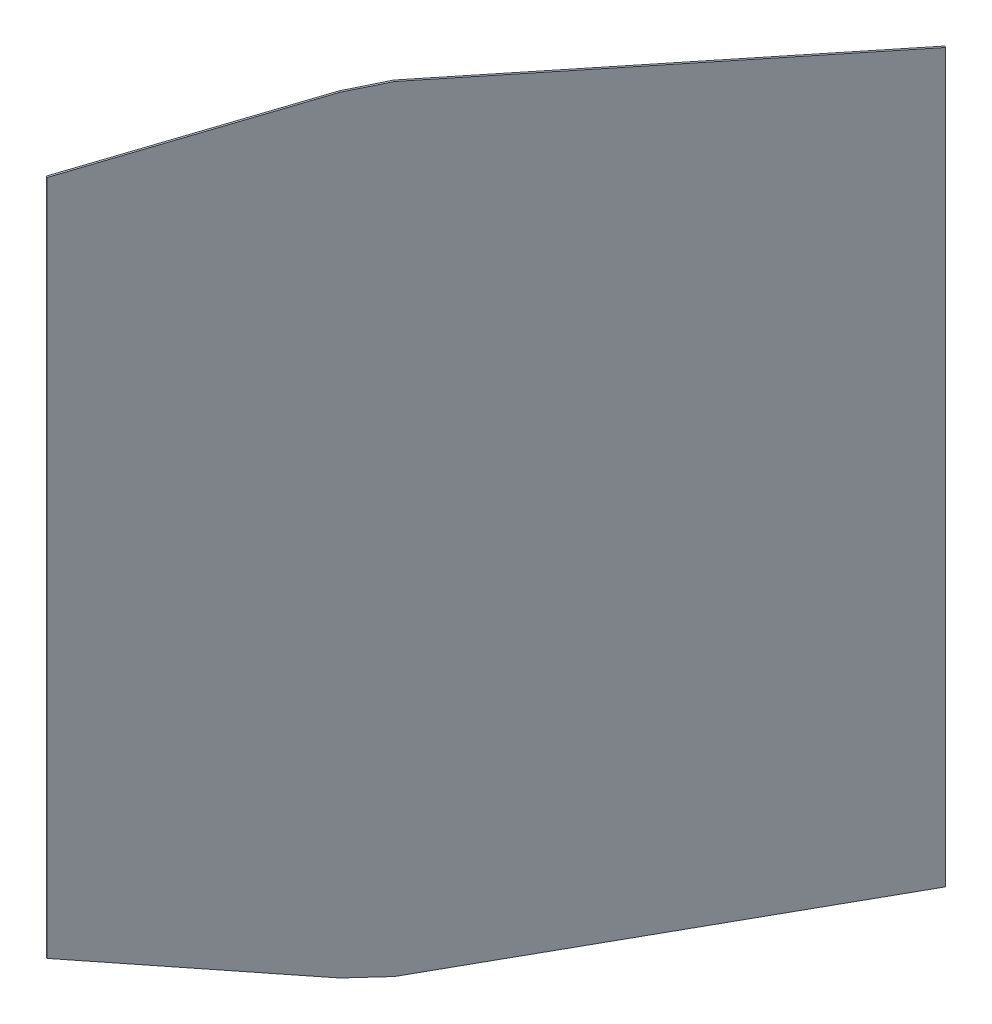
ISO-10303-21;
HEADER;
FILE_DESCRIPTION(('STEP AP214'),'2;1');
FILE_NAME('part.step','',(''),(''),'','','');
FILE_SCHEMA(('AUTOMOTIVE_DESIGN { 1 0 10303 214 1 1 1 1 }'));
ENDSEC;
DATA;
#1=APPLICATION_CONTEXT('core data for automotive mechanical design processes');
#2=APPLICATION_PROTOCOL_DEFINITION('international standard','automotive_design',2000,#1);
#3=PRODUCT_CONTEXT('',#1,'mechanical');
#4=PRODUCT('Part','Part','',(#3));
#5=PRODUCT_RELATED_PRODUCT_CATEGORY('part','',(#4));
#6=PRODUCT_DEFINITION_FORMATION('','',#4);
#7=PRODUCT_DEFINITION_CONTEXT('part definition',#1,'design');
#8=PRODUCT_DEFINITION('design','',#6,#7);
#9=PRODUCT_DEFINITION_SHAPE('','',#8);
#10=(LENGTH_UNIT() NAMED_UNIT(*) SI_UNIT(.MILLI.,.METRE.));
#11=(NAMED_UNIT(*) PLANE_ANGLE_UNIT() SI_UNIT($,.RADIAN.));
#12=(NAMED_UNIT(*) SI_UNIT($,.STERADIAN.) SOLID_ANGLE_UNIT());
#13=UNCERTAINTY_MEASURE_WITH_UNIT(LENGTH_MEASURE(1.E-05),#10,'distance_accuracy_value','');
#14=(GEOMETRIC_REPRESENTATION_CONTEXT(3) GLOBAL_UNCERTAINTY_ASSIGNED_CONTEXT((#13)) GLOBAL_UNIT_ASSIGNED_CONTEXT((#10,
#11,#12)) REPRESENTATION_CONTEXT('',''));
#15=CARTESIAN_POINT('',(0.,0.,0.));
#16=DIRECTION('',(0.,0.,1.));
#17=DIRECTION('',(1.,0.,0.));
#18=AXIS2_PLACEMENT_3D('',#15,#16,#17);
#19=CARTESIAN_POINT('',(339.81309129018,-327.069971053229,-23.014472629478));
#20=DIRECTION('',(-0.559192903470745,0.,0.829037572555043));
#21=DIRECTION('',(0.829037572555043,0.,0.559192903470745));
#22=AXIS2_PLACEMENT_3D('',#19,#20,#21);
#23=PLANE('',#22);
#24=DIRECTION('',(0.,1.,0.));
#25=VECTOR('',#24,1.);
#26=CARTESIAN_POINT('',(338.444350257892,-327.069971053229,-23.9377001131082));
#27=LINE('',#26,#25);
#28=CARTESIAN_POINT('',(338.444350257892,-327.069971053229,-23.9377001131082));
#29=VERTEX_POINT('',#28);
#30=CARTESIAN_POINT('',(338.444350257892,327.069971053229,-23.9377001131082));
#31=VERTEX_POINT('',#30);
#32=EDGE_CURVE('E132',#29,#31,#27,.T.);
#33=ORIENTED_EDGE('',*,*,#32,.T.);
#34=DIRECTION('',(-0.829037572555043,0.,-0.559192903470745));
#35=VECTOR('',#34,1.);
#36=CARTESIAN_POINT('',(339.81309129018,327.069971053229,-23.014472629478));
#37=LINE('',#36,#35);
#38=CARTESIAN_POINT('',(339.81309129018,327.069971053229,-23.014472629478));
#39=VERTEX_POINT('',#38);
#40=EDGE_CURVE('E11',#39,#31,#37,.T.);
#41=ORIENTED_EDGE('',*,*,#40,.F.);
#42=DIRECTION('',(0.,1.,0.));
#43=VECTOR('',#42,1.);
#44=CARTESIAN_POINT('',(339.81309129018,-327.069971053229,-23.014472629478));
#45=LINE('',#44,#43);
#46=CARTESIAN_POINT('',(339.81309129018,-327.069971053229,-23.014472629478));
#47=VERTEX_POINT('',#46);
#48=EDGE_CURVE('E146',#47,#39,#45,.T.);
#49=ORIENTED_EDGE('',*,*,#48,.F.);
#50=DIRECTION('',(-0.829037572555043,0.,-0.559192903470745));
#51=VECTOR('',#50,1.);
#52=CARTESIAN_POINT('',(339.81309129018,-327.069971053229,-23.014472629478));
#53=LINE('',#52,#51);
#54=EDGE_CURVE('E128',#47,#29,#53,.T.);
#55=ORIENTED_EDGE('',*,*,#54,.T.);
#56=EDGE_LOOP('',(#33,#41,#49,#55));
#57=FACE_BOUND('',#56,.T.);
#58=ADVANCED_FACE('F36',(#57),#23,.F.);
#59=CARTESIAN_POINT('',(339.81309129018,327.069971053229,-23.014472629478));
#60=DIRECTION('',(-0.033887074630931,-0.998162132782215,0.0502396541848968));
#61=DIRECTION('',(0.,-0.050268524999457,-0.998735738518643));
#62=AXIS2_PLACEMENT_3D('',#59,#60,#61);
#63=PLANE('',#62);
#64=DIRECTION('',(-0.558165181165038,0.0605999726044517,0.827513911578132));
#65=VECTOR('',#64,1.);
#66=CARTESIAN_POINT('',(338.444350257892,327.069971053229,-23.9377001131082));
#67=LINE('',#66,#65);
#68=CARTESIAN_POINT('',(138.662209663485,348.760310500075,272.251503738087));
#69=VERTEX_POINT('',#68);
#70=EDGE_CURVE('E135',#31,#69,#67,.T.);
#71=ORIENTED_EDGE('',*,*,#70,.T.);
#72=DIRECTION('',(-0.829037572555043,0.,-0.559192903470745));
#73=VECTOR('',#72,1.);
#74=CARTESIAN_POINT('',(140.030950695773,348.760310500075,273.174731221717));
#75=LINE('',#74,#73);
#76=CARTESIAN_POINT('',(140.030950695773,348.760310500075,273.174731221717));
#77=VERTEX_POINT('',#76);
#78=EDGE_CURVE('E44',#77,#69,#75,.T.);
#79=ORIENTED_EDGE('',*,*,#78,.F.);
#80=DIRECTION('',(-0.558165181165038,0.0605999726044517,0.827513911578132));
#81=VECTOR('',#80,1.);
#82=CARTESIAN_POINT('',(339.81309129018,327.069971053229,-23.014472629478));
#83=LINE('',#82,#81);
#84=EDGE_CURVE('E95',#39,#77,#83,.T.);
#85=ORIENTED_EDGE('',*,*,#84,.F.);
#86=ORIENTED_EDGE('',*,*,#40,.T.);
#87=EDGE_LOOP('',(#71,#79,#85,#86));
#88=FACE_BOUND('',#87,.T.);
#89=ADVANCED_FACE('F181',(#88),#63,.F.);
#90=CARTESIAN_POINT('',(140.030950695773,348.760310500075,273.174731221717));
#91=DIRECTION('',(0.0572926382122758,-0.994737542783383,-0.0849398291966421));
#92=DIRECTION('',(0.,0.08507957854872,-0.996374159296583));
#93=AXIS2_PLACEMENT_3D('',#90,#91,#92);
#94=PLANE('',#93);
#95=DIRECTION('',(-0.556250174740395,-0.102455946519846,0.824674797798503));
#96=VECTOR('',#95,1.);
#97=CARTESIAN_POINT('',(138.662209663485,348.760310500075,272.251503738087));
#98=LINE('',#97,#96);
#99=CARTESIAN_POINT('',(118.820679766419,345.105691017116,301.667781519055));
#100=VERTEX_POINT('',#99);
#101=EDGE_CURVE('E137',#69,#100,#98,.T.);
#102=ORIENTED_EDGE('',*,*,#101,.T.);
#103=DIRECTION('',(-0.829037572555043,0.,-0.559192903470745));
#104=VECTOR('',#103,1.);
#105=CARTESIAN_POINT('',(120.189420798707,345.105691017116,302.591009002685));
#106=LINE('',#105,#104);
#107=CARTESIAN_POINT('',(120.189420798707,345.105691017116,302.591009002685));
#108=VERTEX_POINT('',#107);
#109=EDGE_CURVE('E153',#108,#100,#106,.T.);
#110=ORIENTED_EDGE('',*,*,#109,.F.);
#111=DIRECTION('',(-0.556250174740395,-0.102455946519846,0.824674797798503));
#112=VECTOR('',#111,1.);
#113=CARTESIAN_POINT('',(140.030950695773,348.760310500075,273.174731221717));
#114=LINE('',#113,#112);
#115=EDGE_CURVE('E161',#77,#108,#114,.T.);
#116=ORIENTED_EDGE('',*,*,#115,.F.);
#117=ORIENTED_EDGE('',*,*,#78,.T.);
#118=EDGE_LOOP('',(#102,#110,#116,#117));
#119=FACE_BOUND('',#118,.T.);
#120=ADVANCED_FACE('F159',(#119),#94,.F.);
#121=CARTESIAN_POINT('',(120.189420798707,345.105691017116,302.591009002685));
#122=DIRECTION('',(0.117559872307698,-0.977651668292191,-0.174289678146736));
#123=DIRECTION('',(0.,0.17550667714,-0.98447824063271));
#124=AXIS2_PLACEMENT_3D('',#121,#122,#123);
#125=PLANE('',#124);
#126=DIRECTION('',(-0.546695874975328,-0.210231338019561,0.810509965885346));
#127=VECTOR('',#126,1.);
#128=CARTESIAN_POINT('',(118.820679766419,345.105691017116,301.667781519055));
#129=LINE('',#128,#127);
#130=CARTESIAN_POINT('',(12.729079450912,304.308274925451,458.95504723388));
#131=VERTEX_POINT('',#130);
#132=EDGE_CURVE('E139',#100,#131,#129,.T.);
#133=ORIENTED_EDGE('',*,*,#132,.T.);
#134=DIRECTION('',(-0.829037572555043,0.,-0.559192903470745));
#135=VECTOR('',#134,1.);
#136=CARTESIAN_POINT('',(14.0978204832003,304.308274925451,459.87827471751));
#137=LINE('',#136,#135);
#138=CARTESIAN_POINT('',(14.0978204832003,304.308274925451,459.87827471751));
#139=VERTEX_POINT('',#138);
#140=EDGE_CURVE('E150',#139,#131,#137,.T.);
#141=ORIENTED_EDGE('',*,*,#140,.F.);
#142=DIRECTION('',(-0.546695874975328,-0.210231338019561,0.810509965885346));
#143=VECTOR('',#142,1.);
#144=CARTESIAN_POINT('',(120.189420798707,345.105691017116,302.591009002685));
#145=LINE('',#144,#143);
#146=EDGE_CURVE('E173',#108,#139,#145,.T.);
#147=ORIENTED_EDGE('',*,*,#146,.F.);
#148=ORIENTED_EDGE('',*,*,#109,.T.);
#149=EDGE_LOOP('',(#133,#141,#147,#148));
#150=FACE_BOUND('',#149,.T.);
#151=ADVANCED_FACE('F169',(#150),#125,.F.);
#152=CARTESIAN_POINT('',(14.0978204832003,304.308274925451,459.87827471751));
#153=DIRECTION('',(0.559192903470745,0.,-0.829037572555043));
#154=DIRECTION('',(-0.829037572555043,0.,-0.559192903470745));
#155=AXIS2_PLACEMENT_3D('',#152,#153,#154);
#156=PLANE('',#155);
#157=DIRECTION('',(0.,-1.,0.));
#158=VECTOR('',#157,1.);
#159=CARTESIAN_POINT('',(12.729079450912,304.308274925451,458.95504723388));
#160=LINE('',#159,#158);
#161=CARTESIAN_POINT('',(12.729079450912,-304.22650700325,458.95504723388));
#162=VERTEX_POINT('',#161);
#163=EDGE_CURVE('E141',#131,#162,#160,.T.);
#164=ORIENTED_EDGE('',*,*,#163,.T.);
#165=DIRECTION('',(-0.829037572555043,0.,-0.559192903470745));
#166=VECTOR('',#165,1.);
#167=CARTESIAN_POINT('',(14.0978204832003,-304.22650700325,459.87827471751));
#168=LINE('',#167,#166);
#169=CARTESIAN_POINT('',(14.0978204832003,-304.22650700325,459.87827471751));
#170=VERTEX_POINT('',#169);
#171=EDGE_CURVE('E123',#170,#162,#168,.T.);
#172=ORIENTED_EDGE('',*,*,#171,.F.);
#173=DIRECTION('',(0.,-1.,0.));
#174=VECTOR('',#173,1.);
#175=CARTESIAN_POINT('',(14.0978204832003,304.308274925451,459.87827471751));
#176=LINE('',#175,#174);
#177=EDGE_CURVE('E114',#139,#170,#176,.T.);
#178=ORIENTED_EDGE('',*,*,#177,.F.);
#179=ORIENTED_EDGE('',*,*,#140,.T.);
#180=EDGE_LOOP('',(#164,#172,#178,#179));
#181=FACE_BOUND('',#180,.T.);
#182=ADVANCED_FACE('F172',(#181),#156,.F.);
#183=CARTESIAN_POINT('',(14.0978204832003,-304.22650700325,459.87827471751));
#184=DIRECTION('',(0.117785047198825,0.977564990748138,-0.174623513651409));
#185=DIRECTION('',(0.,0.175847568464903,0.984417407741747));
#186=AXIS2_PLACEMENT_3D('',#183,#184,#185);
#187=PLANE('',#186);
#188=DIRECTION('',(0.546647405507803,-0.210634016397146,-0.810438106944629));
#189=VECTOR('',#188,1.);
#190=CARTESIAN_POINT('',(12.729079450912,-304.22650700325,458.95504723388));
#191=LINE('',#190,#189);
#192=CARTESIAN_POINT('',(118.820679766419,-345.105691017116,301.667781519055));
#193=VERTEX_POINT('',#192);
#194=EDGE_CURVE('E122',#162,#193,#191,.T.);
#195=ORIENTED_EDGE('',*,*,#194,.T.);
#196=DIRECTION('',(-0.829037572555043,0.,-0.559192903470745));
#197=VECTOR('',#196,1.);
#198=CARTESIAN_POINT('',(120.189420798707,-345.105691017116,302.591009002685));
#199=LINE('',#198,#197);
#200=CARTESIAN_POINT('',(120.189420798707,-345.105691017116,302.591009002685));
#201=VERTEX_POINT('',#200);
#202=EDGE_CURVE('E119',#201,#193,#199,.T.);
#203=ORIENTED_EDGE('',*,*,#202,.F.);
#204=DIRECTION('',(0.546647405507803,-0.210634016397146,-0.810438106944629));
#205=VECTOR('',#204,1.);
#206=CARTESIAN_POINT('',(14.0978204832003,-304.22650700325,459.87827471751));
#207=LINE('',#206,#205);
#208=EDGE_CURVE('E108',#170,#201,#207,.T.);
#209=ORIENTED_EDGE('',*,*,#208,.F.);
#210=ORIENTED_EDGE('',*,*,#171,.T.);
#211=EDGE_LOOP('',(#195,#203,#209,#210));
#212=FACE_BOUND('',#211,.T.);
#213=ADVANCED_FACE('F120',(#212),#187,.F.);
#214=CARTESIAN_POINT('',(120.189420798707,-345.105691017116,302.591009002685));
#215=DIRECTION('',(0.0572926382122756,0.994737542783383,-0.0849398291966418));
#216=DIRECTION('',(0.,0.0850795785487198,0.996374159296583));
#217=AXIS2_PLACEMENT_3D('',#214,#215,#216);
#218=PLANE('',#217);
#219=DIRECTION('',(0.556250174740394,-0.102455946519845,-0.824674797798504));
#220=VECTOR('',#219,1.);
#221=CARTESIAN_POINT('',(118.820679766419,-345.105691017116,301.667781519055));
#222=LINE('',#221,#220);
#223=CARTESIAN_POINT('',(138.662209663485,-348.760310500075,272.251503738087));
#224=VERTEX_POINT('',#223);
#225=EDGE_CURVE('E81',#193,#224,#222,.T.);
#226=ORIENTED_EDGE('',*,*,#225,.T.);
#227=DIRECTION('',(-0.829037572555043,0.,-0.559192903470745));
#228=VECTOR('',#227,1.);
#229=CARTESIAN_POINT('',(140.030950695773,-348.760310500075,273.174731221717));
#230=LINE('',#229,#228);
#231=CARTESIAN_POINT('',(140.030950695773,-348.760310500075,273.174731221717));
#232=VERTEX_POINT('',#231);
#233=EDGE_CURVE('E124',#232,#224,#230,.T.);
#234=ORIENTED_EDGE('',*,*,#233,.F.);
#235=DIRECTION('',(0.556250174740394,-0.102455946519845,-0.824674797798504));
#236=VECTOR('',#235,1.);
#237=CARTESIAN_POINT('',(120.189420798707,-345.105691017116,302.591009002685));
#238=LINE('',#237,#236);
#239=EDGE_CURVE('E112',#201,#232,#238,.T.);
#240=ORIENTED_EDGE('',*,*,#239,.F.);
#241=ORIENTED_EDGE('',*,*,#202,.T.);
#242=EDGE_LOOP('',(#226,#234,#240,#241));
#243=FACE_BOUND('',#242,.T.);
#244=ADVANCED_FACE('F126',(#243),#218,.F.);
#245=CARTESIAN_POINT('',(140.030950695773,-348.760310500075,273.174731221717));
#246=DIRECTION('',(-0.033887074630931,0.998162132782215,0.0502396541848968));
#247=DIRECTION('',(0.,-0.050268524999457,0.998735738518643));
#248=AXIS2_PLACEMENT_3D('',#245,#246,#247);
#249=PLANE('',#248);
#250=DIRECTION('',(0.558165181165038,0.0605999726044517,-0.827513911578132));
#251=VECTOR('',#250,1.);
#252=CARTESIAN_POINT('',(138.662209663485,-348.760310500075,272.251503738087));
#253=LINE('',#252,#251);
#254=EDGE_CURVE('E87',#224,#29,#253,.T.);
#255=ORIENTED_EDGE('',*,*,#254,.T.);
#256=ORIENTED_EDGE('',*,*,#54,.F.);
#257=DIRECTION('',(0.558165181165038,0.0605999726044517,-0.827513911578132));
#258=VECTOR('',#257,1.);
#259=CARTESIAN_POINT('',(140.030950695773,-348.760310500075,273.174731221717));
#260=LINE('',#259,#258);
#261=EDGE_CURVE('E52',#232,#47,#260,.T.);
#262=ORIENTED_EDGE('',*,*,#261,.F.);
#263=ORIENTED_EDGE('',*,*,#233,.T.);
#264=EDGE_LOOP('',(#255,#256,#262,#263));
#265=FACE_BOUND('',#264,.T.);
#266=ADVANCED_FACE('F197',(#265),#249,.F.);
#267=CARTESIAN_POINT('',(222.885334186553,0.,150.3380561881));
#268=DIRECTION('',(0.829037572555043,0.,0.559192903470745));
#269=DIRECTION('',(0.559192903470745,0.,-0.829037572555043));
#270=AXIS2_PLACEMENT_3D('',#267,#268,#269);
#271=PLANE('',#270);
#272=ORIENTED_EDGE('',*,*,#48,.T.);
#273=ORIENTED_EDGE('',*,*,#84,.T.);
#274=ORIENTED_EDGE('',*,*,#115,.T.);
#275=ORIENTED_EDGE('',*,*,#146,.T.);
#276=ORIENTED_EDGE('',*,*,#177,.T.);
#277=ORIENTED_EDGE('',*,*,#208,.T.);
#278=ORIENTED_EDGE('',*,*,#239,.T.);
#279=ORIENTED_EDGE('',*,*,#261,.T.);
#280=EDGE_LOOP('',(#272,#273,#274,#275,#276,#277,#278,#279));
#281=FACE_BOUND('',#280,.T.);
#282=ADVANCED_FACE('F110',(#281),#271,.T.);
#283=CARTESIAN_POINT('',(221.516593154264,0.,149.414828704469));
#284=DIRECTION('',(0.829037572555043,0.,0.559192903470745));
#285=DIRECTION('',(0.559192903470745,0.,-0.829037572555043));
#286=AXIS2_PLACEMENT_3D('',#283,#284,#285);
#287=PLANE('',#286);
#288=ORIENTED_EDGE('',*,*,#32,.F.);
#289=ORIENTED_EDGE('',*,*,#254,.F.);
#290=ORIENTED_EDGE('',*,*,#225,.F.);
#291=ORIENTED_EDGE('',*,*,#194,.F.);
#292=ORIENTED_EDGE('',*,*,#163,.F.);
#293=ORIENTED_EDGE('',*,*,#132,.F.);
#294=ORIENTED_EDGE('',*,*,#101,.F.);
#295=ORIENTED_EDGE('',*,*,#70,.F.);
#296=EDGE_LOOP('',(#288,#289,#290,#291,#292,#293,#294,#295));
#297=FACE_BOUND('',#296,.T.);
#298=ADVANCED_FACE('F165',(#297),#287,.F.);
#299=CLOSED_SHELL('',(#58,#89,#120,#151,#182,#213,#244,#266,#282,#298));
#300=MANIFOLD_SOLID_BREP('B2',#299);
#301=ADVANCED_BREP_SHAPE_REPRESENTATION('',(#18,#300),#14);
#302=SHAPE_DEFINITION_REPRESENTATION(#9,#301);
ENDSEC;
END-ISO-10303-21;
